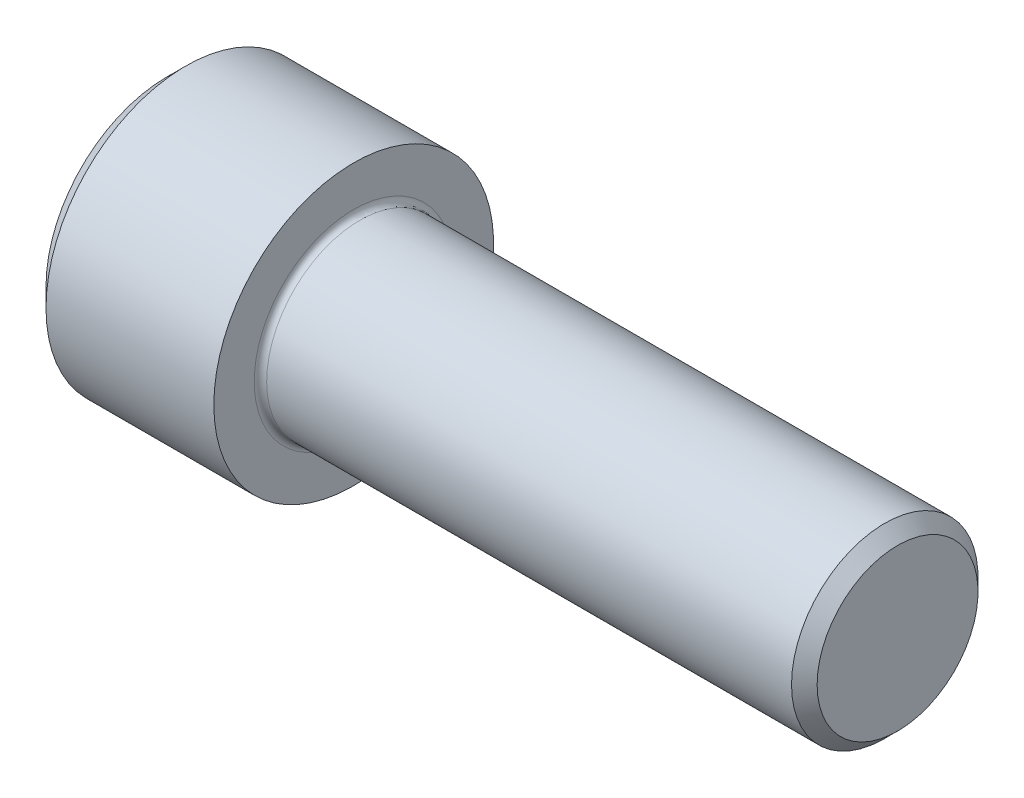
ISO-10303-21;
HEADER;
FILE_DESCRIPTION(('STEP AP214'),'2;1');
FILE_NAME('part.step','',(''),(''),'','','');
FILE_SCHEMA(('AUTOMOTIVE_DESIGN { 1 0 10303 214 1 1 1 1 }'));
ENDSEC;
DATA;
#1=APPLICATION_CONTEXT('core data for automotive mechanical design processes');
#2=APPLICATION_PROTOCOL_DEFINITION('international standard','automotive_design',2000,#1);
#3=PRODUCT_CONTEXT('',#1,'mechanical');
#4=PRODUCT('Part','Part','',(#3));
#5=PRODUCT_RELATED_PRODUCT_CATEGORY('part','',(#4));
#6=PRODUCT_DEFINITION_FORMATION('','',#4);
#7=PRODUCT_DEFINITION_CONTEXT('part definition',#1,'design');
#8=PRODUCT_DEFINITION('design','',#6,#7);
#9=PRODUCT_DEFINITION_SHAPE('','',#8);
#10=(LENGTH_UNIT() NAMED_UNIT(*) SI_UNIT(.MILLI.,.METRE.));
#11=(NAMED_UNIT(*) PLANE_ANGLE_UNIT() SI_UNIT($,.RADIAN.));
#12=(NAMED_UNIT(*) SI_UNIT($,.STERADIAN.) SOLID_ANGLE_UNIT());
#13=UNCERTAINTY_MEASURE_WITH_UNIT(LENGTH_MEASURE(1.E-05),#10,'distance_accuracy_value','');
#14=(GEOMETRIC_REPRESENTATION_CONTEXT(3) GLOBAL_UNCERTAINTY_ASSIGNED_CONTEXT((#13)) GLOBAL_UNIT_ASSIGNED_CONTEXT((#10,
#11,#12)) REPRESENTATION_CONTEXT('',''));
#15=CARTESIAN_POINT('',(0.,0.,0.));
#16=DIRECTION('',(0.,0.,1.));
#17=DIRECTION('',(1.,0.,0.));
#18=AXIS2_PLACEMENT_3D('',#15,#16,#17);
#19=CARTESIAN_POINT('',(37.2308127230006,0.,0.));
#20=DIRECTION('',(-1.,0.,0.));
#21=DIRECTION('',(0.,0.,1.));
#22=AXIS2_PLACEMENT_3D('',#19,#20,#21);
#23=PLANE('',#22);
#24=DIRECTION('',(0.,-0.5,0.866025403784439));
#25=VECTOR('',#24,1.);
#26=CARTESIAN_POINT('',(37.2308127230006,1.112842643863,0.));
#27=LINE('',#26,#25);
#28=CARTESIAN_POINT('',(37.2308127230006,1.112842643863,0.));
#29=VERTEX_POINT('',#28);
#30=CARTESIAN_POINT('',(37.2308127230006,0.556421321931503,0.963749999999999));
#31=VERTEX_POINT('',#30);
#32=EDGE_CURVE('E441',#29,#31,#27,.T.);
#33=ORIENTED_EDGE('',*,*,#32,.T.);
#34=DIRECTION('',(0.,1.,0.));
#35=VECTOR('',#34,1.);
#36=CARTESIAN_POINT('',(37.2308127230006,-0.556421321931501,0.963750000000001));
#37=LINE('',#36,#35);
#38=CARTESIAN_POINT('',(37.2308127230006,-0.556421321931501,0.963750000000001));
#39=VERTEX_POINT('',#38);
#40=EDGE_CURVE('E147',#39,#31,#37,.T.);
#41=ORIENTED_EDGE('',*,*,#40,.F.);
#42=DIRECTION('',(0.,-0.500000000000001,-0.866025403784438));
#43=VECTOR('',#42,1.);
#44=CARTESIAN_POINT('',(37.2308127230006,-0.556421321931501,0.963750000000001));
#45=LINE('',#44,#43);
#46=CARTESIAN_POINT('',(37.2308127230006,-1.112842643863,0.));
#47=VERTEX_POINT('',#46);
#48=EDGE_CURVE('E446',#39,#47,#45,.T.);
#49=ORIENTED_EDGE('',*,*,#48,.T.);
#50=DIRECTION('',(0.,0.5,-0.866025403784439));
#51=VECTOR('',#50,1.);
#52=CARTESIAN_POINT('',(37.2308127230006,-1.112842643863,0.));
#53=LINE('',#52,#51);
#54=CARTESIAN_POINT('',(37.2308127230006,-0.556421321931503,-0.963749999999999));
#55=VERTEX_POINT('',#54);
#56=EDGE_CURVE('E450',#47,#55,#53,.T.);
#57=ORIENTED_EDGE('',*,*,#56,.T.);
#58=DIRECTION('',(0.,-1.,0.));
#59=VECTOR('',#58,1.);
#60=CARTESIAN_POINT('',(37.2308127230006,0.556421321931501,-0.96375));
#61=LINE('',#60,#59);
#62=CARTESIAN_POINT('',(37.2308127230006,0.556421321931501,-0.96375));
#63=VERTEX_POINT('',#62);
#64=EDGE_CURVE('E454',#63,#55,#61,.T.);
#65=ORIENTED_EDGE('',*,*,#64,.F.);
#66=DIRECTION('',(0.,-0.500000000000001,-0.866025403784438));
#67=VECTOR('',#66,1.);
#68=CARTESIAN_POINT('',(37.2308127230006,1.112842643863,0.));
#69=LINE('',#68,#67);
#70=EDGE_CURVE('E142',#29,#63,#69,.T.);
#71=ORIENTED_EDGE('',*,*,#70,.F.);
#72=EDGE_LOOP('',(#33,#41,#49,#57,#65,#71));
#73=FACE_BOUND('',#72,.T.);
#74=CARTESIAN_POINT('',(37.2308127230006,0.,0.));
#75=DIRECTION('',(-1.,0.,0.));
#76=DIRECTION('',(0.,0.,1.));
#77=AXIS2_PLACEMENT_3D('',#74,#75,#76);
#78=CIRCLE('',#77,1.56);
#79=CARTESIAN_POINT('',(37.2308127230006,0.,1.56));
#80=VERTEX_POINT('',#79);
#81=EDGE_CURVE('E161',#80,#80,#78,.T.);
#82=ORIENTED_EDGE('',*,*,#81,.T.);
#83=EDGE_LOOP('',(#82));
#84=FACE_BOUND('',#83,.T.);
#85=ADVANCED_FACE('F48',(#73,#84),#23,.T.);
#86=CARTESIAN_POINT('',(46.6308127230006,1.0352,0.));
#87=DIRECTION('',(1.,0.,0.));
#88=DIRECTION('',(0.,0.,-1.));
#89=AXIS2_PLACEMENT_3D('',#86,#87,#88);
#90=PLANE('',#89);
#91=CARTESIAN_POINT('',(46.6308127230006,0.,0.));
#92=DIRECTION('',(-1.,0.,0.));
#93=DIRECTION('',(0.,0.,1.));
#94=AXIS2_PLACEMENT_3D('',#91,#92,#93);
#95=CIRCLE('',#94,1.0352);
#96=CARTESIAN_POINT('',(46.6308127230006,0.,1.0352));
#97=VERTEX_POINT('',#96);
#98=EDGE_CURVE('E179',#97,#97,#95,.T.);
#99=ORIENTED_EDGE('',*,*,#98,.F.);
#100=EDGE_LOOP('',(#99));
#101=FACE_BOUND('',#100,.T.);
#102=ADVANCED_FACE('F202',(#101),#90,.T.);
#103=CARTESIAN_POINT('',(46.6308127230006,0.,0.));
#104=DIRECTION('',(-1.,0.,0.));
#105=DIRECTION('',(0.,0.,1.));
#106=AXIS2_PLACEMENT_3D('',#103,#104,#105);
#107=CONICAL_SURFACE('',#106,1.0352,0.785398163397234);
#108=CARTESIAN_POINT('',(46.4660127230005,0.,0.));
#109=DIRECTION('',(-1.,0.,0.));
#110=DIRECTION('',(0.,0.,1.));
#111=AXIS2_PLACEMENT_3D('',#108,#109,#110);
#112=CIRCLE('',#111,1.19999999999996);
#113=CARTESIAN_POINT('',(46.4660127230005,0.,1.19999999999996));
#114=VERTEX_POINT('',#113);
#115=EDGE_CURVE('E175',#114,#114,#112,.T.);
#116=ORIENTED_EDGE('',*,*,#115,.F.);
#117=EDGE_LOOP('',(#116));
#118=FACE_BOUND('',#117,.T.);
#119=ORIENTED_EDGE('',*,*,#98,.T.);
#120=EDGE_LOOP('',(#119));
#121=FACE_BOUND('',#120,.T.);
#122=ADVANCED_FACE('F208',(#118,#121),#107,.T.);
#123=CARTESIAN_POINT('',(34.0558127230006,0.,0.));
#124=DIRECTION('',(-1.,0.,0.));
#125=DIRECTION('',(0.,0.,1.));
#126=AXIS2_PLACEMENT_3D('',#123,#124,#125);
#127=CYLINDRICAL_SURFACE('',#126,1.19999999999998);
#128=CARTESIAN_POINT('',(39.7108127230006,0.,0.));
#129=DIRECTION('',(1.,0.,0.));
#130=DIRECTION('',(0.,0.,-1.));
#131=AXIS2_PLACEMENT_3D('',#128,#129,#130);
#132=CIRCLE('',#131,1.19999999999998);
#133=CARTESIAN_POINT('',(39.7108127230006,0.,-1.19999999999998));
#134=VERTEX_POINT('',#133);
#135=EDGE_CURVE('E12',#134,#134,#132,.T.);
#136=ORIENTED_EDGE('',*,*,#135,.T.);
#137=EDGE_LOOP('',(#136));
#138=FACE_BOUND('',#137,.T.);
#139=ORIENTED_EDGE('',*,*,#115,.T.);
#140=EDGE_LOOP('',(#139));
#141=FACE_BOUND('',#140,.T.);
#142=ADVANCED_FACE('F219',(#138,#141),#127,.T.);
#143=CARTESIAN_POINT('',(39.6308127230006,1.8,0.));
#144=DIRECTION('',(1.,0.,0.));
#145=DIRECTION('',(0.,0.,-1.));
#146=AXIS2_PLACEMENT_3D('',#143,#144,#145);
#147=PLANE('',#146);
#148=CARTESIAN_POINT('',(39.6308127230006,0.,0.));
#149=DIRECTION('',(1.,0.,0.));
#150=DIRECTION('',(0.,0.,-1.));
#151=AXIS2_PLACEMENT_3D('',#148,#149,#150);
#152=CIRCLE('',#151,1.27999999999998);
#153=CARTESIAN_POINT('',(39.6308127230006,0.,-1.27999999999998));
#154=VERTEX_POINT('',#153);
#155=EDGE_CURVE('E57',#154,#154,#152,.F.);
#156=ORIENTED_EDGE('',*,*,#155,.T.);
#157=EDGE_LOOP('',(#156));
#158=FACE_BOUND('',#157,.T.);
#159=CARTESIAN_POINT('',(39.6308127230006,0.,0.));
#160=DIRECTION('',(-1.,0.,0.));
#161=DIRECTION('',(0.,0.,1.));
#162=AXIS2_PLACEMENT_3D('',#159,#160,#161);
#163=CIRCLE('',#162,1.8);
#164=CARTESIAN_POINT('',(39.6308127230006,0.,1.8));
#165=VERTEX_POINT('',#164);
#166=EDGE_CURVE('E171',#165,#165,#163,.T.);
#167=ORIENTED_EDGE('',*,*,#166,.F.);
#168=EDGE_LOOP('',(#167));
#169=FACE_BOUND('',#168,.T.);
#170=ADVANCED_FACE('F186',(#158,#169),#147,.T.);
#171=CARTESIAN_POINT('',(34.0558127230006,0.,0.));
#172=DIRECTION('',(-1.,0.,0.));
#173=DIRECTION('',(0.,0.,1.));
#174=AXIS2_PLACEMENT_3D('',#171,#172,#173);
#175=CYLINDRICAL_SURFACE('',#174,1.8);
#176=ORIENTED_EDGE('',*,*,#166,.T.);
#177=EDGE_LOOP('',(#176));
#178=FACE_BOUND('',#177,.T.);
#179=CARTESIAN_POINT('',(37.4708127230006,0.,0.));
#180=DIRECTION('',(-1.,0.,0.));
#181=DIRECTION('',(0.,0.,1.));
#182=AXIS2_PLACEMENT_3D('',#179,#180,#181);
#183=CIRCLE('',#182,1.8);
#184=CARTESIAN_POINT('',(37.4708127230006,0.,1.8));
#185=VERTEX_POINT('',#184);
#186=EDGE_CURVE('E167',#185,#185,#183,.T.);
#187=ORIENTED_EDGE('',*,*,#186,.F.);
#188=EDGE_LOOP('',(#187));
#189=FACE_BOUND('',#188,.T.);
#190=ADVANCED_FACE('F197',(#178,#189),#175,.T.);
#191=CARTESIAN_POINT('',(37.2308127230006,0.,0.));
#192=DIRECTION('',(1.,0.,0.));
#193=DIRECTION('',(0.,0.,-1.));
#194=AXIS2_PLACEMENT_3D('',#191,#192,#193);
#195=CONICAL_SURFACE('',#194,1.56,0.785398163397449);
#196=ORIENTED_EDGE('',*,*,#186,.T.);
#197=EDGE_LOOP('',(#196));
#198=FACE_BOUND('',#197,.T.);
#199=ORIENTED_EDGE('',*,*,#81,.F.);
#200=EDGE_LOOP('',(#199));
#201=FACE_BOUND('',#200,.T.);
#202=ADVANCED_FACE('F190',(#198,#201),#195,.T.);
#203=CARTESIAN_POINT('',(39.7108127230006,0.,0.));
#204=DIRECTION('',(1.,0.,0.));
#205=DIRECTION('',(0.,0.,-1.));
#206=AXIS2_PLACEMENT_3D('',#203,#204,#205);
#207=TOROIDAL_SURFACE('',#206,1.27999999999998,0.08);
#208=ORIENTED_EDGE('',*,*,#135,.F.);
#209=EDGE_LOOP('',(#208));
#210=FACE_BOUND('',#209,.T.);
#211=ORIENTED_EDGE('',*,*,#155,.F.);
#212=EDGE_LOOP('',(#211));
#213=FACE_BOUND('',#212,.T.);
#214=ADVANCED_FACE('F50',(#210,#213),#207,.F.);
#215=CARTESIAN_POINT('',(38.4308127230006,1.112842643863,0.));
#216=DIRECTION('',(0.,-0.866025403784439,-0.5));
#217=DIRECTION('',(0.,0.5,-0.866025403784439));
#218=AXIS2_PLACEMENT_3D('',#215,#216,#217);
#219=PLANE('',#218);
#220=ORIENTED_EDGE('',*,*,#32,.F.);
#221=DIRECTION('',(-1.,0.,0.));
#222=VECTOR('',#221,1.);
#223=CARTESIAN_POINT('',(38.4308127230006,1.112842643863,0.));
#224=LINE('',#223,#222);
#225=CARTESIAN_POINT('',(38.4308127230006,1.112842643863,0.));
#226=VERTEX_POINT('',#225);
#227=EDGE_CURVE('E440',#226,#29,#224,.T.);
#228=ORIENTED_EDGE('',*,*,#227,.F.);
#229=DIRECTION('',(0.,-0.5,0.866025403784439));
#230=VECTOR('',#229,1.);
#231=CARTESIAN_POINT('',(38.4308127230006,1.112842643863,0.));
#232=LINE('',#231,#230);
#233=CARTESIAN_POINT('',(38.4308127230006,0.834631982897253,0.481875));
#234=VERTEX_POINT('',#233);
#235=EDGE_CURVE('E133',#226,#234,#232,.T.);
#236=ORIENTED_EDGE('',*,*,#235,.T.);
#237=CARTESIAN_POINT('',(38.4308127230006,0.556421321931503,0.963749999999999));
#238=VERTEX_POINT('',#237);
#239=EDGE_CURVE('E123',#234,#238,#232,.T.);
#240=ORIENTED_EDGE('',*,*,#239,.T.);
#241=DIRECTION('',(-1.,0.,0.));
#242=VECTOR('',#241,1.);
#243=CARTESIAN_POINT('',(38.4308127230006,0.556421321931503,0.963749999999999));
#244=LINE('',#243,#242);
#245=EDGE_CURVE('E138',#238,#31,#244,.T.);
#246=ORIENTED_EDGE('',*,*,#245,.T.);
#247=EDGE_LOOP('',(#220,#228,#236,#240,#246));
#248=FACE_BOUND('',#247,.T.);
#249=ADVANCED_FACE('F137',(#248),#219,.T.);
#250=CARTESIAN_POINT('',(38.4308127230006,-0.556421321931501,0.963750000000001));
#251=DIRECTION('',(0.,0.,1.));
#252=DIRECTION('',(0.,-1.,0.));
#253=AXIS2_PLACEMENT_3D('',#250,#251,#252);
#254=PLANE('',#253);
#255=ORIENTED_EDGE('',*,*,#40,.T.);
#256=ORIENTED_EDGE('',*,*,#245,.F.);
#257=DIRECTION('',(0.,1.,0.));
#258=VECTOR('',#257,1.);
#259=CARTESIAN_POINT('',(38.4308127230006,-0.556421321931501,0.963750000000001));
#260=LINE('',#259,#258);
#261=CARTESIAN_POINT('',(38.4308127230006,0.,0.96375));
#262=VERTEX_POINT('',#261);
#263=EDGE_CURVE('E120',#262,#238,#260,.T.);
#264=ORIENTED_EDGE('',*,*,#263,.F.);
#265=CARTESIAN_POINT('',(38.4308127230006,-0.556421321931501,0.963750000000001));
#266=VERTEX_POINT('',#265);
#267=EDGE_CURVE('E132',#266,#262,#260,.T.);
#268=ORIENTED_EDGE('',*,*,#267,.F.);
#269=DIRECTION('',(-1.,0.,0.));
#270=VECTOR('',#269,1.);
#271=CARTESIAN_POINT('',(38.4308127230006,-0.556421321931501,0.963750000000001));
#272=LINE('',#271,#270);
#273=EDGE_CURVE('E150',#266,#39,#272,.T.);
#274=ORIENTED_EDGE('',*,*,#273,.T.);
#275=EDGE_LOOP('',(#255,#256,#264,#268,#274));
#276=FACE_BOUND('',#275,.T.);
#277=ADVANCED_FACE('F144',(#276),#254,.F.);
#278=CARTESIAN_POINT('',(38.4308127230006,-0.556421321931501,0.963750000000001));
#279=DIRECTION('',(0.,0.866025403784438,-0.500000000000001));
#280=DIRECTION('',(0.,0.500000000000001,0.866025403784438));
#281=AXIS2_PLACEMENT_3D('',#278,#279,#280);
#282=PLANE('',#281);
#283=ORIENTED_EDGE('',*,*,#48,.F.);
#284=ORIENTED_EDGE('',*,*,#273,.F.);
#285=DIRECTION('',(0.,-0.500000000000001,-0.866025403784438));
#286=VECTOR('',#285,1.);
#287=CARTESIAN_POINT('',(38.4308127230006,-0.556421321931501,0.963750000000001));
#288=LINE('',#287,#286);
#289=CARTESIAN_POINT('',(38.4308127230006,-0.834631982897252,0.481875000000002));
#290=VERTEX_POINT('',#289);
#291=EDGE_CURVE('E415',#266,#290,#288,.T.);
#292=ORIENTED_EDGE('',*,*,#291,.T.);
#293=CARTESIAN_POINT('',(38.4308127230006,-1.112842643863,0.));
#294=VERTEX_POINT('',#293);
#295=EDGE_CURVE('E417',#290,#294,#288,.T.);
#296=ORIENTED_EDGE('',*,*,#295,.T.);
#297=DIRECTION('',(-1.,0.,0.));
#298=VECTOR('',#297,1.);
#299=CARTESIAN_POINT('',(38.4308127230006,-1.112842643863,0.));
#300=LINE('',#299,#298);
#301=EDGE_CURVE('E157',#294,#47,#300,.T.);
#302=ORIENTED_EDGE('',*,*,#301,.T.);
#303=EDGE_LOOP('',(#283,#284,#292,#296,#302));
#304=FACE_BOUND('',#303,.T.);
#305=ADVANCED_FACE('F270',(#304),#282,.T.);
#306=CARTESIAN_POINT('',(38.4308127230006,-1.112842643863,0.));
#307=DIRECTION('',(0.,0.866025403784439,0.5));
#308=DIRECTION('',(0.,-0.5,0.866025403784439));
#309=AXIS2_PLACEMENT_3D('',#306,#307,#308);
#310=PLANE('',#309);
#311=ORIENTED_EDGE('',*,*,#56,.F.);
#312=ORIENTED_EDGE('',*,*,#301,.F.);
#313=DIRECTION('',(0.,0.5,-0.866025403784439));
#314=VECTOR('',#313,1.);
#315=CARTESIAN_POINT('',(38.4308127230006,-1.112842643863,0.));
#316=LINE('',#315,#314);
#317=CARTESIAN_POINT('',(38.4308127230006,-0.834631982897253,-0.481874999999999));
#318=VERTEX_POINT('',#317);
#319=EDGE_CURVE('E420',#294,#318,#316,.T.);
#320=ORIENTED_EDGE('',*,*,#319,.T.);
#321=CARTESIAN_POINT('',(38.4308127230006,-0.556421321931503,-0.963749999999999));
#322=VERTEX_POINT('',#321);
#323=EDGE_CURVE('E426',#318,#322,#316,.T.);
#324=ORIENTED_EDGE('',*,*,#323,.T.);
#325=DIRECTION('',(-1.,0.,0.));
#326=VECTOR('',#325,1.);
#327=CARTESIAN_POINT('',(38.4308127230006,-0.556421321931503,-0.963749999999999));
#328=LINE('',#327,#326);
#329=EDGE_CURVE('E467',#322,#55,#328,.T.);
#330=ORIENTED_EDGE('',*,*,#329,.T.);
#331=EDGE_LOOP('',(#311,#312,#320,#324,#330));
#332=FACE_BOUND('',#331,.T.);
#333=ADVANCED_FACE('F279',(#332),#310,.T.);
#334=CARTESIAN_POINT('',(38.4308127230006,0.556421321931501,-0.96375));
#335=DIRECTION('',(0.,0.,-1.));
#336=DIRECTION('',(0.,1.,0.));
#337=AXIS2_PLACEMENT_3D('',#334,#335,#336);
#338=PLANE('',#337);
#339=ORIENTED_EDGE('',*,*,#64,.T.);
#340=ORIENTED_EDGE('',*,*,#329,.F.);
#341=DIRECTION('',(0.,-1.,0.));
#342=VECTOR('',#341,1.);
#343=CARTESIAN_POINT('',(38.4308127230006,0.556421321931501,-0.96375));
#344=LINE('',#343,#342);
#345=CARTESIAN_POINT('',(38.4308127230006,0.,-0.963749999999999));
#346=VERTEX_POINT('',#345);
#347=EDGE_CURVE('E432',#346,#322,#344,.T.);
#348=ORIENTED_EDGE('',*,*,#347,.F.);
#349=CARTESIAN_POINT('',(38.4308127230006,0.556421321931501,-0.96375));
#350=VERTEX_POINT('',#349);
#351=EDGE_CURVE('E64',#350,#346,#344,.T.);
#352=ORIENTED_EDGE('',*,*,#351,.F.);
#353=DIRECTION('',(-1.,0.,0.));
#354=VECTOR('',#353,1.);
#355=CARTESIAN_POINT('',(38.4308127230006,0.556421321931501,-0.96375));
#356=LINE('',#355,#354);
#357=EDGE_CURVE('E463',#350,#63,#356,.T.);
#358=ORIENTED_EDGE('',*,*,#357,.T.);
#359=EDGE_LOOP('',(#339,#340,#348,#352,#358));
#360=FACE_BOUND('',#359,.T.);
#361=ADVANCED_FACE('F289',(#360),#338,.F.);
#362=CARTESIAN_POINT('',(38.4308127230006,1.112842643863,0.));
#363=DIRECTION('',(0.,0.866025403784438,-0.500000000000001));
#364=DIRECTION('',(0.,0.500000000000001,0.866025403784438));
#365=AXIS2_PLACEMENT_3D('',#362,#363,#364);
#366=PLANE('',#365);
#367=ORIENTED_EDGE('',*,*,#70,.T.);
#368=ORIENTED_EDGE('',*,*,#357,.F.);
#369=DIRECTION('',(0.,-0.500000000000001,-0.866025403784438));
#370=VECTOR('',#369,1.);
#371=CARTESIAN_POINT('',(38.4308127230006,1.112842643863,0.));
#372=LINE('',#371,#370);
#373=CARTESIAN_POINT('',(38.4308127230006,0.834631982897253,-0.481875000000001));
#374=VERTEX_POINT('',#373);
#375=EDGE_CURVE('E435',#374,#350,#372,.T.);
#376=ORIENTED_EDGE('',*,*,#375,.F.);
#377=EDGE_CURVE('E436',#226,#374,#372,.T.);
#378=ORIENTED_EDGE('',*,*,#377,.F.);
#379=ORIENTED_EDGE('',*,*,#227,.T.);
#380=EDGE_LOOP('',(#367,#368,#376,#378,#379));
#381=FACE_BOUND('',#380,.T.);
#382=ADVANCED_FACE('F299',(#381),#366,.F.);
#383=CARTESIAN_POINT('',(38.4308127230006,1.112842643863,0.));
#384=DIRECTION('',(1.,0.,0.));
#385=DIRECTION('',(0.,0.,-1.));
#386=AXIS2_PLACEMENT_3D('',#383,#384,#385);
#387=PLANE('',#386);
#388=ORIENTED_EDGE('',*,*,#347,.T.);
#389=ORIENTED_EDGE('',*,*,#323,.F.);
#390=CARTESIAN_POINT('',(38.4308127230006,0.,0.));
#391=DIRECTION('',(-1.,0.,0.));
#392=DIRECTION('',(0.,0.,1.));
#393=AXIS2_PLACEMENT_3D('',#390,#391,#392);
#394=CIRCLE('',#393,0.96375);
#395=EDGE_CURVE('E480',#346,#318,#394,.T.);
#396=ORIENTED_EDGE('',*,*,#395,.F.);
#397=EDGE_LOOP('',(#388,#389,#396));
#398=FACE_BOUND('',#397,.T.);
#399=ADVANCED_FACE('F309',(#398),#387,.F.);
#400=ORIENTED_EDGE('',*,*,#319,.F.);
#401=ORIENTED_EDGE('',*,*,#295,.F.);
#402=EDGE_CURVE('E155',#318,#290,#394,.T.);
#403=ORIENTED_EDGE('',*,*,#402,.F.);
#404=EDGE_LOOP('',(#400,#401,#403));
#405=FACE_BOUND('',#404,.T.);
#406=ADVANCED_FACE('F319',(#405),#387,.F.);
#407=ORIENTED_EDGE('',*,*,#291,.F.);
#408=ORIENTED_EDGE('',*,*,#267,.T.);
#409=EDGE_CURVE('E149',#290,#262,#394,.T.);
#410=ORIENTED_EDGE('',*,*,#409,.F.);
#411=EDGE_LOOP('',(#407,#408,#410));
#412=FACE_BOUND('',#411,.T.);
#413=ADVANCED_FACE('F330',(#412),#387,.F.);
#414=ORIENTED_EDGE('',*,*,#263,.T.);
#415=ORIENTED_EDGE('',*,*,#239,.F.);
#416=EDGE_CURVE('E126',#262,#234,#394,.T.);
#417=ORIENTED_EDGE('',*,*,#416,.F.);
#418=EDGE_LOOP('',(#414,#415,#417));
#419=FACE_BOUND('',#418,.T.);
#420=ADVANCED_FACE('F122',(#419),#387,.F.);
#421=ORIENTED_EDGE('',*,*,#235,.F.);
#422=ORIENTED_EDGE('',*,*,#377,.T.);
#423=EDGE_CURVE('E162',#234,#374,#394,.T.);
#424=ORIENTED_EDGE('',*,*,#423,.F.);
#425=EDGE_LOOP('',(#421,#422,#424));
#426=FACE_BOUND('',#425,.T.);
#427=ADVANCED_FACE('F347',(#426),#387,.F.);
#428=ORIENTED_EDGE('',*,*,#375,.T.);
#429=ORIENTED_EDGE('',*,*,#351,.T.);
#430=EDGE_CURVE('E478',#374,#346,#394,.T.);
#431=ORIENTED_EDGE('',*,*,#430,.F.);
#432=EDGE_LOOP('',(#428,#429,#431));
#433=FACE_BOUND('',#432,.T.);
#434=ADVANCED_FACE('F322',(#433),#387,.F.);
#435=CARTESIAN_POINT('',(38.4308127230006,0.,0.));
#436=DIRECTION('',(-1.,0.,0.));
#437=DIRECTION('',(0.,0.,1.));
#438=AXIS2_PLACEMENT_3D('',#435,#436,#437);
#439=CONICAL_SURFACE('',#438,0.96375,1.04719755119659);
#440=CARTESIAN_POINT('',(38.9872340449321,0.,0.));
#441=VERTEX_POINT('',#440);
#442=VERTEX_LOOP('',#441);
#443=FACE_BOUND('',#442,.T.);
#444=ORIENTED_EDGE('',*,*,#416,.T.);
#445=ORIENTED_EDGE('',*,*,#423,.T.);
#446=ORIENTED_EDGE('',*,*,#430,.T.);
#447=ORIENTED_EDGE('',*,*,#395,.T.);
#448=ORIENTED_EDGE('',*,*,#402,.T.);
#449=ORIENTED_EDGE('',*,*,#409,.T.);
#450=EDGE_LOOP('',(#444,#445,#446,#447,#448,#449));
#451=FACE_BOUND('',#450,.T.);
#452=ADVANCED_FACE('F212',(#443,#451),#439,.F.);
#453=CLOSED_SHELL('',(#85,#102,#122,#142,#170,#190,#202,#214,#249,#277,#305,#333,#361,#382,#399,
#406,#413,#420,#427,#434,#452));
#454=MANIFOLD_SOLID_BREP('B2',#453);
#455=ADVANCED_BREP_SHAPE_REPRESENTATION('',(#18,#454),#14);
#456=SHAPE_DEFINITION_REPRESENTATION(#9,#455);
ENDSEC;
END-ISO-10303-21;
